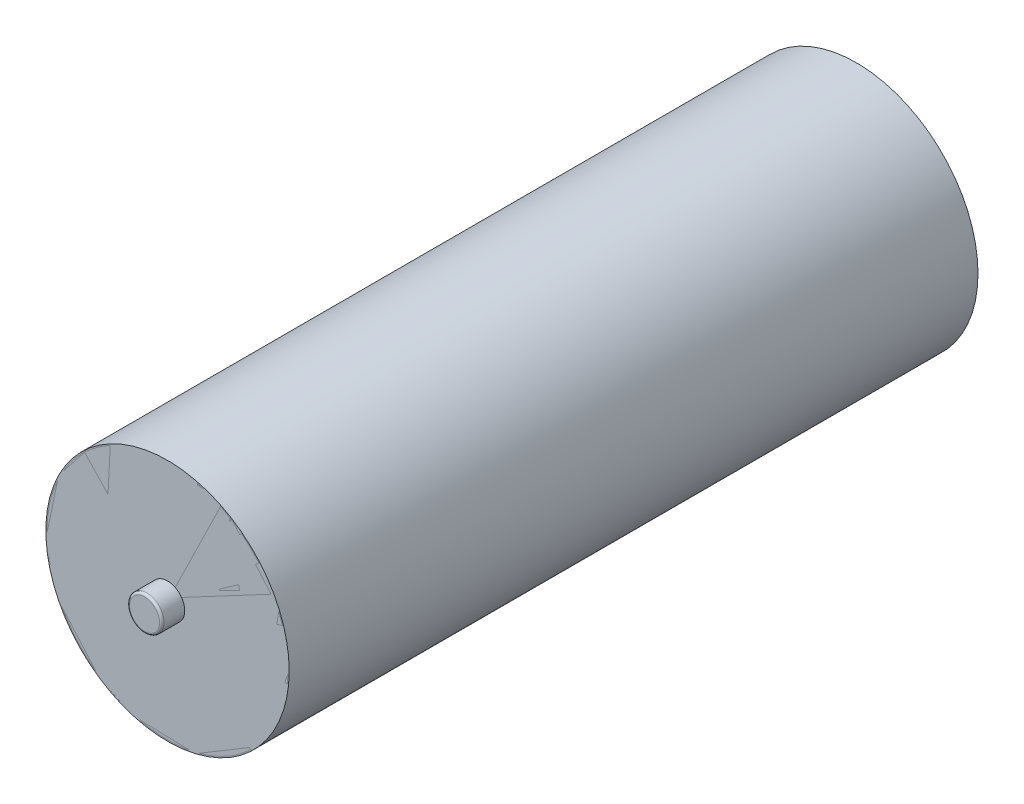
ISO-10303-21;
HEADER;
FILE_DESCRIPTION(('STEP AP214'),'2;1');
FILE_NAME('part.step','',(''),(''),'','','');
FILE_SCHEMA(('AUTOMOTIVE_DESIGN { 1 0 10303 214 1 1 1 1 }'));
ENDSEC;
DATA;
#1=APPLICATION_CONTEXT('core data for automotive mechanical design processes');
#2=APPLICATION_PROTOCOL_DEFINITION('international standard','automotive_design',2000,#1);
#3=PRODUCT_CONTEXT('',#1,'mechanical');
#4=PRODUCT('Part','Part','',(#3));
#5=PRODUCT_RELATED_PRODUCT_CATEGORY('part','',(#4));
#6=PRODUCT_DEFINITION_FORMATION('','',#4);
#7=PRODUCT_DEFINITION_CONTEXT('part definition',#1,'design');
#8=PRODUCT_DEFINITION('design','',#6,#7);
#9=PRODUCT_DEFINITION_SHAPE('','',#8);
#10=(LENGTH_UNIT() NAMED_UNIT(*) SI_UNIT(.MILLI.,.METRE.));
#11=(NAMED_UNIT(*) PLANE_ANGLE_UNIT() SI_UNIT($,.RADIAN.));
#12=(NAMED_UNIT(*) SI_UNIT($,.STERADIAN.) SOLID_ANGLE_UNIT());
#13=UNCERTAINTY_MEASURE_WITH_UNIT(LENGTH_MEASURE(1.E-05),#10,'distance_accuracy_value','');
#14=(GEOMETRIC_REPRESENTATION_CONTEXT(3) GLOBAL_UNCERTAINTY_ASSIGNED_CONTEXT((#13)) GLOBAL_UNIT_ASSIGNED_CONTEXT((#10,
#11,#12)) REPRESENTATION_CONTEXT('',''));
#15=CARTESIAN_POINT('',(0.,0.,0.));
#16=DIRECTION('',(0.,0.,1.));
#17=DIRECTION('',(1.,0.,0.));
#18=AXIS2_PLACEMENT_3D('',#15,#16,#17);
#19=CARTESIAN_POINT('',(0.,0.,-150.));
#20=DIRECTION('',(0.,0.,1.));
#21=DIRECTION('',(1.,0.,0.));
#22=AXIS2_PLACEMENT_3D('',#19,#20,#21);
#23=CYLINDRICAL_SURFACE('',#22,53.);
#24=CARTESIAN_POINT('',(0.,0.,-150.));
#25=DIRECTION('',(0.,0.,1.));
#26=DIRECTION('',(1.,0.,0.));
#27=AXIS2_PLACEMENT_3D('',#24,#25,#26);
#28=CIRCLE('',#27,53.);
#29=CARTESIAN_POINT('',(53.,0.,-150.));
#30=VERTEX_POINT('',#29);
#31=EDGE_CURVE('E11',#30,#30,#28,.T.);
#32=ORIENTED_EDGE('',*,*,#31,.T.);
#33=EDGE_LOOP('',(#32));
#34=FACE_BOUND('',#33,.T.);
#35=CARTESIAN_POINT('',(0.,0.,150.));
#36=DIRECTION('',(0.,0.,1.));
#37=DIRECTION('',(1.,0.,0.));
#38=AXIS2_PLACEMENT_3D('',#35,#36,#37);
#39=CIRCLE('',#38,53.);
#40=CARTESIAN_POINT('',(53.,0.,150.));
#41=VERTEX_POINT('',#40);
#42=EDGE_CURVE('E49',#41,#41,#39,.T.);
#43=ORIENTED_EDGE('',*,*,#42,.F.);
#44=EDGE_LOOP('',(#43));
#45=FACE_BOUND('',#44,.T.);
#46=ADVANCED_FACE('F43',(#34,#45),#23,.T.);
#47=CARTESIAN_POINT('',(0.,0.,-150.));
#48=DIRECTION('',(0.,0.,1.));
#49=DIRECTION('',(1.,0.,0.));
#50=AXIS2_PLACEMENT_3D('',#47,#48,#49);
#51=PLANE('',#50);
#52=ORIENTED_EDGE('',*,*,#31,.F.);
#53=EDGE_LOOP('',(#52));
#54=FACE_BOUND('',#53,.T.);
#55=ADVANCED_FACE('F58',(#54),#51,.F.);
#56=CARTESIAN_POINT('',(0.,0.,150.));
#57=DIRECTION('',(0.,0.,1.));
#58=DIRECTION('',(1.,0.,0.));
#59=AXIS2_PLACEMENT_3D('',#56,#57,#58);
#60=PLANE('',#59);
#61=ORIENTED_EDGE('',*,*,#42,.T.);
#62=EDGE_LOOP('',(#61));
#63=FACE_BOUND('',#62,.T.);
#64=ADVANCED_FACE('F55',(#63),#60,.T.);
#65=CLOSED_SHELL('',(#46,#55,#64));
#66=MANIFOLD_SOLID_BREP('B2',#65);
#67=CARTESIAN_POINT('',(0.,0.,150.));
#68=DIRECTION('',(0.,0.,1.));
#69=DIRECTION('',(1.,0.,0.));
#70=AXIS2_PLACEMENT_3D('',#67,#68,#69);
#71=PLANE('',#70);
#72=CARTESIAN_POINT('',(0.,0.,150.));
#73=DIRECTION('',(0.,0.,1.));
#74=DIRECTION('',(1.,0.,0.));
#75=AXIS2_PLACEMENT_3D('',#72,#73,#74);
#76=CIRCLE('',#75,52.5);
#77=CARTESIAN_POINT('',(52.5,0.,150.));
#78=VERTEX_POINT('',#77);
#79=EDGE_CURVE('E104',#78,#78,#76,.T.);
#80=ORIENTED_EDGE('',*,*,#79,.T.);
#81=EDGE_LOOP('',(#80));
#82=FACE_BOUND('',#81,.T.);
#83=CARTESIAN_POINT('',(0.,0.,150.));
#84=DIRECTION('',(0.,0.,1.));
#85=DIRECTION('',(1.,0.,0.));
#86=AXIS2_PLACEMENT_3D('',#83,#84,#85);
#87=CIRCLE('',#86,7.5);
#88=CARTESIAN_POINT('',(7.5,0.,150.));
#89=VERTEX_POINT('',#88);
#90=EDGE_CURVE('E113',#89,#89,#87,.T.);
#91=ORIENTED_EDGE('',*,*,#90,.F.);
#92=EDGE_LOOP('',(#91));
#93=FACE_BOUND('',#92,.T.);
#94=ADVANCED_FACE('F84',(#82,#93),#71,.T.);
#95=CARTESIAN_POINT('',(0.,0.,-150.));
#96=DIRECTION('',(0.,0.,-1.));
#97=DIRECTION('',(-1.,0.,0.));
#98=AXIS2_PLACEMENT_3D('',#95,#96,#97);
#99=PLANE('',#98);
#100=CARTESIAN_POINT('',(0.,0.,-150.));
#101=DIRECTION('',(0.,0.,-1.));
#102=DIRECTION('',(-1.,0.,0.));
#103=AXIS2_PLACEMENT_3D('',#100,#101,#102);
#104=CIRCLE('',#103,52.5);
#105=CARTESIAN_POINT('',(-52.5,0.,-150.));
#106=VERTEX_POINT('',#105);
#107=EDGE_CURVE('E107',#106,#106,#104,.T.);
#108=ORIENTED_EDGE('',*,*,#107,.T.);
#109=EDGE_LOOP('',(#108));
#110=FACE_BOUND('',#109,.T.);
#111=CARTESIAN_POINT('',(0.,0.,-150.));
#112=DIRECTION('',(0.,0.,-1.));
#113=DIRECTION('',(-1.,0.,0.));
#114=AXIS2_PLACEMENT_3D('',#111,#112,#113);
#115=CIRCLE('',#114,7.5);
#116=CARTESIAN_POINT('',(-7.5,0.,-150.));
#117=VERTEX_POINT('',#116);
#118=EDGE_CURVE('E110',#117,#117,#115,.T.);
#119=ORIENTED_EDGE('',*,*,#118,.F.);
#120=EDGE_LOOP('',(#119));
#121=FACE_BOUND('',#120,.T.);
#122=ADVANCED_FACE('F120',(#110,#121),#99,.T.);
#123=CARTESIAN_POINT('',(0.,0.,150.));
#124=DIRECTION('',(0.,0.,-1.));
#125=DIRECTION('',(-1.,0.,0.));
#126=AXIS2_PLACEMENT_3D('',#123,#124,#125);
#127=CYLINDRICAL_SURFACE('',#126,52.5);
#128=ORIENTED_EDGE('',*,*,#79,.F.);
#129=EDGE_LOOP('',(#128));
#130=FACE_BOUND('',#129,.T.);
#131=ORIENTED_EDGE('',*,*,#107,.F.);
#132=EDGE_LOOP('',(#131));
#133=FACE_BOUND('',#132,.T.);
#134=ADVANCED_FACE('F126',(#130,#133),#127,.T.);
#135=CARTESIAN_POINT('',(0.,0.,-160.));
#136=DIRECTION('',(0.,0.,1.));
#137=DIRECTION('',(1.,0.,0.));
#138=AXIS2_PLACEMENT_3D('',#135,#136,#137);
#139=CYLINDRICAL_SURFACE('',#138,7.5);
#140=CARTESIAN_POINT('',(0.,0.,-159.));
#141=DIRECTION('',(0.,0.,-1.));
#142=DIRECTION('',(-1.,0.,0.));
#143=AXIS2_PLACEMENT_3D('',#140,#141,#142);
#144=CIRCLE('',#143,7.5);
#145=CARTESIAN_POINT('',(-7.5,0.,-159.));
#146=VERTEX_POINT('',#145);
#147=EDGE_CURVE('E95',#146,#146,#144,.F.);
#148=ORIENTED_EDGE('',*,*,#147,.T.);
#149=EDGE_LOOP('',(#148));
#150=FACE_BOUND('',#149,.T.);
#151=ORIENTED_EDGE('',*,*,#118,.T.);
#152=EDGE_LOOP('',(#151));
#153=FACE_BOUND('',#152,.T.);
#154=ADVANCED_FACE('F132',(#150,#153),#139,.T.);
#155=CARTESIAN_POINT('',(0.,0.,-160.));
#156=DIRECTION('',(0.,0.,-1.));
#157=DIRECTION('',(-1.,0.,0.));
#158=AXIS2_PLACEMENT_3D('',#155,#156,#157);
#159=PLANE('',#158);
#160=CARTESIAN_POINT('',(0.,0.,-160.));
#161=DIRECTION('',(0.,0.,-1.));
#162=DIRECTION('',(-1.,0.,0.));
#163=AXIS2_PLACEMENT_3D('',#160,#161,#162);
#164=CIRCLE('',#163,6.5);
#165=CARTESIAN_POINT('',(-6.5,0.,-160.));
#166=VERTEX_POINT('',#165);
#167=EDGE_CURVE('E99',#166,#166,#164,.T.);
#168=ORIENTED_EDGE('',*,*,#167,.T.);
#169=EDGE_LOOP('',(#168));
#170=FACE_BOUND('',#169,.T.);
#171=ADVANCED_FACE('F136',(#170),#159,.T.);
#172=CARTESIAN_POINT('',(0.,0.,-159.));
#173=DIRECTION('',(0.,0.,-1.));
#174=DIRECTION('',(-1.,0.,0.));
#175=AXIS2_PLACEMENT_3D('',#172,#173,#174);
#176=TOROIDAL_SURFACE('',#175,6.5,1.);
#177=ORIENTED_EDGE('',*,*,#147,.F.);
#178=EDGE_LOOP('',(#177));
#179=FACE_BOUND('',#178,.T.);
#180=ORIENTED_EDGE('',*,*,#167,.F.);
#181=EDGE_LOOP('',(#180));
#182=FACE_BOUND('',#181,.T.);
#183=ADVANCED_FACE('F134',(#179,#182),#176,.T.);
#184=CARTESIAN_POINT('',(0.,0.,160.));
#185=DIRECTION('',(0.,0.,-1.));
#186=DIRECTION('',(-1.,0.,0.));
#187=AXIS2_PLACEMENT_3D('',#184,#185,#186);
#188=CYLINDRICAL_SURFACE('',#187,7.5);
#189=CARTESIAN_POINT('',(0.,0.,159.));
#190=DIRECTION('',(0.,0.,1.));
#191=DIRECTION('',(1.,0.,0.));
#192=AXIS2_PLACEMENT_3D('',#189,#190,#191);
#193=CIRCLE('',#192,7.5);
#194=CARTESIAN_POINT('',(7.5,0.,159.));
#195=VERTEX_POINT('',#194);
#196=EDGE_CURVE('E42',#195,#195,#193,.F.);
#197=ORIENTED_EDGE('',*,*,#196,.T.);
#198=EDGE_LOOP('',(#197));
#199=FACE_BOUND('',#198,.T.);
#200=ORIENTED_EDGE('',*,*,#90,.T.);
#201=EDGE_LOOP('',(#200));
#202=FACE_BOUND('',#201,.T.);
#203=ADVANCED_FACE('F117',(#199,#202),#188,.T.);
#204=CARTESIAN_POINT('',(0.,0.,160.));
#205=DIRECTION('',(0.,0.,1.));
#206=DIRECTION('',(1.,0.,0.));
#207=AXIS2_PLACEMENT_3D('',#204,#205,#206);
#208=PLANE('',#207);
#209=CARTESIAN_POINT('',(0.,0.,160.));
#210=DIRECTION('',(0.,0.,1.));
#211=DIRECTION('',(1.,0.,0.));
#212=AXIS2_PLACEMENT_3D('',#209,#210,#211);
#213=CIRCLE('',#212,6.5);
#214=CARTESIAN_POINT('',(6.5,0.,160.));
#215=VERTEX_POINT('',#214);
#216=EDGE_CURVE('E91',#215,#215,#213,.T.);
#217=ORIENTED_EDGE('',*,*,#216,.T.);
#218=EDGE_LOOP('',(#217));
#219=FACE_BOUND('',#218,.T.);
#220=ADVANCED_FACE('F142',(#219),#208,.T.);
#221=CARTESIAN_POINT('',(0.,0.,159.));
#222=DIRECTION('',(0.,0.,1.));
#223=DIRECTION('',(1.,0.,0.));
#224=AXIS2_PLACEMENT_3D('',#221,#222,#223);
#225=TOROIDAL_SURFACE('',#224,6.5,1.);
#226=ORIENTED_EDGE('',*,*,#196,.F.);
#227=EDGE_LOOP('',(#226));
#228=FACE_BOUND('',#227,.T.);
#229=ORIENTED_EDGE('',*,*,#216,.F.);
#230=EDGE_LOOP('',(#229));
#231=FACE_BOUND('',#230,.T.);
#232=ADVANCED_FACE('F86',(#228,#231),#225,.T.);
#233=CLOSED_SHELL('',(#94,#122,#134,#154,#171,#183,#203,#220,#232));
#234=MANIFOLD_SOLID_BREP('B6',#233);
#235=ADVANCED_BREP_SHAPE_REPRESENTATION('',(#18,#66,#234),#14);
#236=SHAPE_DEFINITION_REPRESENTATION(#9,#235);
ENDSEC;
END-ISO-10303-21;
